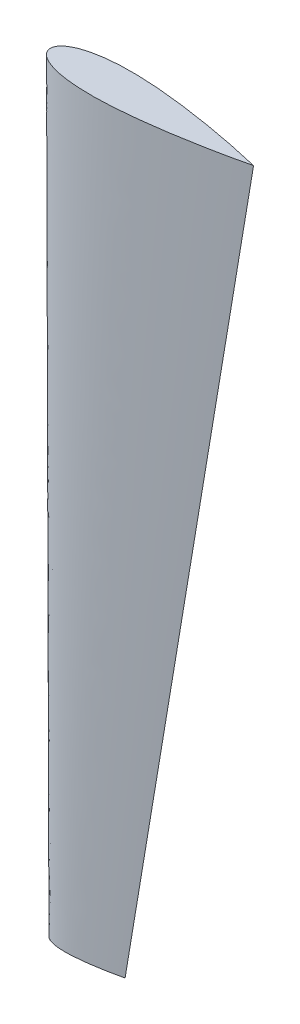
ISO-10303-21;
HEADER;
FILE_DESCRIPTION(('STEP AP214'),'2;1');
FILE_NAME('part.step','',(''),(''),'','','');
FILE_SCHEMA(('AUTOMOTIVE_DESIGN { 1 0 10303 214 1 1 1 1 }'));
ENDSEC;
DATA;
#1=APPLICATION_CONTEXT('core data for automotive mechanical design processes');
#2=APPLICATION_PROTOCOL_DEFINITION('international standard','automotive_design',2000,#1);
#3=PRODUCT_CONTEXT('',#1,'mechanical');
#4=PRODUCT('Part','Part','',(#3));
#5=PRODUCT_RELATED_PRODUCT_CATEGORY('part','',(#4));
#6=PRODUCT_DEFINITION_FORMATION('','',#4);
#7=PRODUCT_DEFINITION_CONTEXT('part definition',#1,'design');
#8=PRODUCT_DEFINITION('design','',#6,#7);
#9=PRODUCT_DEFINITION_SHAPE('','',#8);
#10=(LENGTH_UNIT() NAMED_UNIT(*) SI_UNIT(.MILLI.,.METRE.));
#11=(NAMED_UNIT(*) PLANE_ANGLE_UNIT() SI_UNIT($,.RADIAN.));
#12=(NAMED_UNIT(*) SI_UNIT($,.STERADIAN.) SOLID_ANGLE_UNIT());
#13=UNCERTAINTY_MEASURE_WITH_UNIT(LENGTH_MEASURE(1.E-05),#10,'distance_accuracy_value','');
#14=(GEOMETRIC_REPRESENTATION_CONTEXT(3) GLOBAL_UNCERTAINTY_ASSIGNED_CONTEXT((#13)) GLOBAL_UNIT_ASSIGNED_CONTEXT((#10,
#11,#12)) REPRESENTATION_CONTEXT('',''));
#15=CARTESIAN_POINT('',(0.,0.,0.));
#16=DIRECTION('',(0.,0.,1.));
#17=DIRECTION('',(1.,0.,0.));
#18=AXIS2_PLACEMENT_3D('',#15,#16,#17);
#19=CARTESIAN_POINT('',(66.0178620616339,514.,12.1870773540183));
#20=DIRECTION('',(0.,-1.,0.));
#21=DIRECTION('',(0.,0.,-1.));
#22=AXIS2_PLACEMENT_3D('',#19,#20,#21);
#23=PLANE('',#22);
#24=CARTESIAN_POINT('',(0.,514.,-3.58879872712089E-12));
#25=CARTESIAN_POINT('',(-9.62389065432209E-05,514.,0.229826737293405));
#26=CARTESIAN_POINT('',(0.0203386864435173,514.,0.626377200940641));
#27=CARTESIAN_POINT('',(0.10246108280261,514.,1.20171389372342));
#28=CARTESIAN_POINT('',(0.311904811280085,514.,1.94931182640597));
#29=CARTESIAN_POINT('',(0.605447679738566,514.,2.66244555417272));
#30=CARTESIAN_POINT('',(1.027685977397,514.,3.41930257540994));
#31=CARTESIAN_POINT('',(1.61928269539491,514.,4.23690298840914));
#32=CARTESIAN_POINT('',(2.44409296410368,514.,5.1338522154251));
#33=CARTESIAN_POINT('',(3.60602649969797,514.,6.13791511730763));
#34=CARTESIAN_POINT('',(5.25185526426223,514.,7.26308481056953));
#35=CARTESIAN_POINT('',(7.54715016389206,514.,8.48956799779035));
#36=CARTESIAN_POINT('',(10.7862450507375,514.,9.81456784612829));
#37=CARTESIAN_POINT('',(14.9988819464501,514.,11.0780777681388));
#38=CARTESIAN_POINT('',(21.1448502055022,514.,12.3689712831595));
#39=CARTESIAN_POINT('',(29.0419896559888,514.,13.3110862714259));
#40=CARTESIAN_POINT('',(38.2843743035246,514.,13.7180246588027));
#41=CARTESIAN_POINT('',(48.6947882758269,514.,13.5365121366165));
#42=CARTESIAN_POINT('',(59.084069854855,514.,12.8875223108892));
#43=CARTESIAN_POINT('',(69.4444186753305,514.,11.8840149961523));
#44=CARTESIAN_POINT('',(79.7733856541514,514.,10.6042324725989));
#45=CARTESIAN_POINT('',(88.7848000115046,514.,9.28769971435329));
#46=CARTESIAN_POINT('',(96.4895454807425,514.,8.03899914374762));
#47=CARTESIAN_POINT('',(102.898095596124,514.,6.92276219430765));
#48=CARTESIAN_POINT('',(108.015717075038,514.,5.98590645888455));
#49=CARTESIAN_POINT('',(112.48902046287,514.,5.12698484650111));
#50=CARTESIAN_POINT('',(116.313274011786,514.,4.36398312797738));
#51=CARTESIAN_POINT('',(119.503911266981,514.,3.70727426462731));
#52=CARTESIAN_POINT('',(121.721649175323,514.,3.2407052226471));
#53=CARTESIAN_POINT('',(123.647234718723,514.,2.82700244224191));
#54=CARTESIAN_POINT('',(125.521665439083,514.,2.41932597007425));
#55=CARTESIAN_POINT('',(127.174331301088,514.,2.05225729333034));
#56=CARTESIAN_POINT('',(128.65143701865,514.,1.72222406225193));
#57=CARTESIAN_POINT('',(130.720100002365,514.,1.2476966868119));
#58=CARTESIAN_POINT('',(132.31691175783,514.,0.880619787764973));
#59=CARTESIAN_POINT('',(134.292315332336,514.,0.411219700931635));
#60=CARTESIAN_POINT('',(135.424693489945,514.,0.139368002056263));
#61=CARTESIAN_POINT('',(135.999999999464,514.,1.26223972346886E-10));
#62=B_SPLINE_CURVE_WITH_KNOTS('',4,(#24,#25,#26,#27,#28,#29,#30,#31,#32,#33,#34,#35,#36,#37,#38,
#39,#40,#41,#42,#43,#44,#45,#46,#47,#48,#49,#50,#51,#52,#53,#54,#55,#56,#57,#58,#59,#60,#61),
.UNSPECIFIED.,.F.,.F.,(5,1,1,1,1,1,1,1,1,1,1,1,1,1,1,1,1,1,1,1,1,1,1,1,1,1,1,1,1,1,1,1,1,1,5),
(0.,0.00587453097731684,0.010168378239424,0.0148281459801956,0.0198354441070051,
0.0255747363868891,0.0323088782353767,0.0406095113955877,0.0509668935399592,0.0648121190604378,
0.0832532478295698,0.107120705349692,0.14042968191049,0.177263566086309,0.243881637309456,
0.310499708067123,0.377117784194045,0.443735860910882,0.510353937013769,0.576972013445223,
0.643590090639979,0.676899129664545,0.71020816868911,0.743517207401256,0.776826246113401,
0.793480765951165,0.810135285788928,0.826789805626691,0.835117065545573,0.843444325464454,
0.86009884511682,0.868426104943003,0.876753364769186,0.893407884421552,0.910062404073918),.UNSPECIFIED.);
#63=CARTESIAN_POINT('',(0.,514.,-3.58968690554059E-12));
#64=VERTEX_POINT('',#63);
#65=CARTESIAN_POINT('',(135.999999999508,514.,-1.22707127833556E-10));
#66=VERTEX_POINT('',#65);
#67=EDGE_CURVE('E71',#64,#66,#62,.T.);
#68=ORIENTED_EDGE('',*,*,#67,.T.);
#69=CARTESIAN_POINT('',(135.999999999508,514.,-1.22707127833556E-10));
#70=CARTESIAN_POINT('',(135.424693489978,514.,-0.139368002055618));
#71=CARTESIAN_POINT('',(134.292315332367,514.,-0.411219700931609));
#72=CARTESIAN_POINT('',(132.31691175784,514.,-0.880619787769804));
#73=CARTESIAN_POINT('',(130.720100002365,514.,-1.24769668681908));
#74=CARTESIAN_POINT('',(128.65143701865,514.,-1.7222240622591));
#75=CARTESIAN_POINT('',(127.174331301088,514.,-2.05225729333752));
#76=CARTESIAN_POINT('',(125.521665439083,514.,-2.41932597008143));
#77=CARTESIAN_POINT('',(123.647234718723,514.,-2.82700244224909));
#78=CARTESIAN_POINT('',(121.721649175323,514.,-3.24070522265428));
#79=CARTESIAN_POINT('',(119.503911266981,514.,-3.70727426463448));
#80=CARTESIAN_POINT('',(116.313274011786,514.,-4.36398312798456));
#81=CARTESIAN_POINT('',(112.48902046287,514.,-5.12698484650829));
#82=CARTESIAN_POINT('',(108.015717075038,514.,-5.98590645889172));
#83=CARTESIAN_POINT('',(102.898095596124,514.,-6.92276219431483));
#84=CARTESIAN_POINT('',(96.4895454807425,514.,-8.0389991437548));
#85=CARTESIAN_POINT('',(88.7848000115046,514.,-9.28769971436047));
#86=CARTESIAN_POINT('',(79.7733856541514,514.,-10.604232472606));
#87=CARTESIAN_POINT('',(69.4444186753305,514.,-11.8840149961595));
#88=CARTESIAN_POINT('',(59.084069854855,514.,-12.8875223108964));
#89=CARTESIAN_POINT('',(48.6947882758269,514.,-13.5365121366237));
#90=CARTESIAN_POINT('',(38.2843743035246,514.,-13.7180246588099));
#91=CARTESIAN_POINT('',(29.0419896559888,514.,-13.3110862714331));
#92=CARTESIAN_POINT('',(21.1448502055022,514.,-12.3689712831667));
#93=CARTESIAN_POINT('',(14.9988819464501,514.,-11.078077768146));
#94=CARTESIAN_POINT('',(10.7862450507375,514.,-9.81456784613547));
#95=CARTESIAN_POINT('',(7.54715016389206,514.,-8.48956799779753));
#96=CARTESIAN_POINT('',(5.25185526426223,514.,-7.26308481057671));
#97=CARTESIAN_POINT('',(3.60602649969797,514.,-6.13791511731481));
#98=CARTESIAN_POINT('',(2.44409296410368,514.,-5.13385221543228));
#99=CARTESIAN_POINT('',(1.61928269539491,514.,-4.23690298841632));
#100=CARTESIAN_POINT('',(1.027685977397,514.,-3.41930257541712));
#101=CARTESIAN_POINT('',(0.605447679738566,514.,-2.6624455541799));
#102=CARTESIAN_POINT('',(0.311904811280085,514.,-1.94931182641315));
#103=CARTESIAN_POINT('',(0.10246108280261,514.,-1.2017138937306));
#104=CARTESIAN_POINT('',(0.0203386864435173,514.,-0.62637720094782));
#105=CARTESIAN_POINT('',(-9.62389065432209E-05,514.,-0.229826737300583));
#106=CARTESIAN_POINT('',(0.,514.,-3.58968690554059E-12));
#107=B_SPLINE_CURVE_WITH_KNOTS('',4,(#69,#70,#71,#72,#73,#74,#75,#76,#77,#78,#79,#80,#81,#82,
#83,#84,#85,#86,#87,#88,#89,#90,#91,#92,#93,#94,#95,#96,#97,#98,#99,#100,#101,#102,#103,#104,
#105,#106),.UNSPECIFIED.,.F.,.F.,(5,1,1,1,1,1,1,1,1,1,1,1,1,1,1,1,1,1,1,1,1,1,1,1,1,1,1,1,1,1,1,
1,1,1,5),(0.,0.0166545196523659,0.0333090393047316,0.0416362991309146,0.0499635589570975,
0.0666180786094633,0.074945338528345,0.0832725984472266,0.0999271182849898,0.116581638122753,
0.133236157960516,0.166545196672662,0.199854235384807,0.233163274409373,0.266472313433939,
0.333090390628695,0.399708467060149,0.466326543163036,0.532944619879873,0.599562696006795,
0.666180766764462,0.732798837987609,0.769632722163427,0.802941698724226,0.826809156244348,
0.84525028501348,0.859095510533958,0.86945289267833,0.877753525838541,0.884487667687029,
0.890226959966913,0.895234258093722,0.899894025834494,0.904187873096601,0.910062404073918),.UNSPECIFIED.);
#108=EDGE_CURVE('E12',#66,#64,#107,.T.);
#109=ORIENTED_EDGE('',*,*,#108,.T.);
#110=EDGE_LOOP('',(#68,#109));
#111=FACE_BOUND('',#110,.T.);
#112=ADVANCED_FACE('F61',(#111),#23,.F.);
#113=CARTESIAN_POINT('',(24.2712617534065,0.,4.48054582805587));
#114=DIRECTION('',(0.,-1.,0.));
#115=DIRECTION('',(0.,0.,-1.));
#116=AXIS2_PLACEMENT_3D('',#113,#114,#115);
#117=PLANE('',#116);
#118=CARTESIAN_POINT('',(0.,0.,0.));
#119=CARTESIAN_POINT('',(-3.57597322857492E-05,0.,0.084497568888036));
#120=CARTESIAN_POINT('',(0.00747749906732974,0.,0.230287239826051));
#121=CARTESIAN_POINT('',(0.0376698863574468,0.,0.441804118405084));
#122=CARTESIAN_POINT('',(0.114670660824089,0.,0.716660066376853));
#123=CARTESIAN_POINT('',(0.222591161663102,0.,0.978839520024002));
#124=CARTESIAN_POINT('',(0.377825674088309,0.,1.25709694766434));
#125=CARTESIAN_POINT('',(0.595324455384656,0.,1.55768470827881));
#126=CARTESIAN_POINT('',(0.898563756079407,0.,1.8874457732575));
#127=CARTESIAN_POINT('',(1.32574470774678,0.,2.25658643812188));
#128=CARTESIAN_POINT('',(1.93082974290689,0.,2.67025167576308));
#129=CARTESIAN_POINT('',(2.77468652819462,0.,3.1211649230953));
#130=CARTESIAN_POINT('',(3.96553304621347,0.,3.60829659124632));
#131=CARTESIAN_POINT('',(5.514291907565,0.,4.07282340728828));
#132=CARTESIAN_POINT('',(7.77384720306645,0.,4.54741465579239));
#133=CARTESIAN_POINT('',(10.6771922410552,0.,4.89378409830209));
#134=CARTESIAN_POINT('',(14.0751535762197,0.,5.04338755005186));
#135=CARTESIAN_POINT('',(17.9024724549107,0.,4.97666450694003));
#136=CARTESIAN_POINT('',(21.7221212013291,0.,4.73805077452825));
#137=CARTESIAN_POINT('',(25.5309755502663,0.,4.3691378876451));
#138=CARTESIAN_POINT('',(29.3285571230623,0.,3.89858904743883));
#139=CARTESIAN_POINT('',(32.6412984597572,0.,3.41463722967284));
#140=CARTESIAN_POINT('',(35.4743653385762,0.,2.95544945825426));
#141=CARTESIAN_POINT('',(37.8297349497232,0.,2.54524163111396));
#142=CARTESIAN_POINT('',(39.7126170500219,0.,2.20046895817504));
#143=CARTESIAN_POINT('',(41.589312775238,0.,1.84026717255085));
#144=CARTESIAN_POINT('',(43.2341035438203,0.,1.50940545406725));
#145=CARTESIAN_POINT('',(44.6326942516853,0.,1.21743530792212));
#146=CARTESIAN_POINT('',(45.8112139261382,0.,0.963318516211182));
#147=CARTESIAN_POINT('',(46.7266390701642,0.,0.761946879555926));
#148=CARTESIAN_POINT('',(47.6959028902503,0.,0.542685100454476));
#149=CARTESIAN_POINT('',(48.559880658311,0.,0.343928912386446));
#150=CARTESIAN_POINT('',(49.3595466036412,0.,0.154242875548077));
#151=CARTESIAN_POINT('',(49.7884902537762,0.,0.0512382360226681));
#152=CARTESIAN_POINT('',(49.9999999999664,0.,8.15106896752495E-12));
#153=B_SPLINE_CURVE_WITH_KNOTS('',4,(#118,#119,#120,#121,#122,#123,#124,#125,#126,#127,#128,
#129,#130,#131,#132,#133,#134,#135,#136,#137,#138,#139,#140,#141,#142,#143,#144,#145,#146,#147,
#148,#149,#150,#151,#152),.UNSPECIFIED.,.F.,.F.,(5,1,1,1,1,1,1,1,1,1,1,1,1,1,1,1,1,1,1,1,1,1,1,
1,1,1,1,1,1,1,1,5),(0.,0.00587453097731684,0.010168378239424,0.0148281459801956,
0.019835444107005,0.0255747363868891,0.0323088782353766,0.0406095113955876,0.050966893539959,
0.0648121190604376,0.0832532478295695,0.107120705349691,0.14042968191049,0.177263566086309,
0.243881637309455,0.310499708067123,0.377117784194047,0.443735860910885,0.51035393701377,
0.576972013445224,0.643590090639975,0.676899129664538,0.710208168689101,0.743517207401244,
0.776826246113387,0.810135285788911,0.826789805626673,0.843444325464435,0.860098845116806,
0.876753364769177,0.893407884421549,0.91006240407392),.UNSPECIFIED.);
#154=CARTESIAN_POINT('',(0.,0.,0.));
#155=VERTEX_POINT('',#154);
#156=CARTESIAN_POINT('',(49.9999999999691,0.,-7.47887518688634E-12));
#157=VERTEX_POINT('',#156);
#158=EDGE_CURVE('E95',#155,#157,#153,.T.);
#159=ORIENTED_EDGE('',*,*,#158,.F.);
#160=CARTESIAN_POINT('',(49.9999999999691,0.,-7.47887518688634E-12));
#161=CARTESIAN_POINT('',(49.7884902537783,0.,-0.0512382360221614));
#162=CARTESIAN_POINT('',(49.3595466036429,0.,-0.154242875547662));
#163=CARTESIAN_POINT('',(48.5598806583117,0.,-0.343928912386284));
#164=CARTESIAN_POINT('',(47.6959028902503,0.,-0.542685100454476));
#165=CARTESIAN_POINT('',(46.7266390701642,0.,-0.761946879555926));
#166=CARTESIAN_POINT('',(45.8112139261382,0.,-0.963318516211182));
#167=CARTESIAN_POINT('',(44.6326942516853,0.,-1.21743530792212));
#168=CARTESIAN_POINT('',(43.2341035438203,0.,-1.50940545406725));
#169=CARTESIAN_POINT('',(41.589312775238,0.,-1.84026717255085));
#170=CARTESIAN_POINT('',(39.7126170500219,0.,-2.20046895817504));
#171=CARTESIAN_POINT('',(37.8297349497232,0.,-2.54524163111396));
#172=CARTESIAN_POINT('',(35.4743653385762,0.,-2.95544945825426));
#173=CARTESIAN_POINT('',(32.6412984597572,0.,-3.41463722967284));
#174=CARTESIAN_POINT('',(29.3285571230623,0.,-3.89858904743883));
#175=CARTESIAN_POINT('',(25.5309755502663,0.,-4.3691378876451));
#176=CARTESIAN_POINT('',(21.7221212013291,0.,-4.73805077452825));
#177=CARTESIAN_POINT('',(17.9024724549107,0.,-4.97666450694003));
#178=CARTESIAN_POINT('',(14.0751535762197,0.,-5.04338755005186));
#179=CARTESIAN_POINT('',(10.6771922410552,0.,-4.89378409830209));
#180=CARTESIAN_POINT('',(7.77384720306645,0.,-4.54741465579239));
#181=CARTESIAN_POINT('',(5.514291907565,0.,-4.07282340728828));
#182=CARTESIAN_POINT('',(3.96553304621347,0.,-3.60829659124632));
#183=CARTESIAN_POINT('',(2.77468652819462,0.,-3.1211649230953));
#184=CARTESIAN_POINT('',(1.93082974290689,0.,-2.67025167576308));
#185=CARTESIAN_POINT('',(1.32574470774678,0.,-2.25658643812188));
#186=CARTESIAN_POINT('',(0.898563756079407,0.,-1.8874457732575));
#187=CARTESIAN_POINT('',(0.595324455384656,0.,-1.55768470827881));
#188=CARTESIAN_POINT('',(0.377825674088309,0.,-1.25709694766434));
#189=CARTESIAN_POINT('',(0.222591161663102,0.,-0.978839520024002));
#190=CARTESIAN_POINT('',(0.114670660824089,0.,-0.716660066376853));
#191=CARTESIAN_POINT('',(0.0376698863574468,0.,-0.441804118405084));
#192=CARTESIAN_POINT('',(0.00747749906732974,0.,-0.230287239826051));
#193=CARTESIAN_POINT('',(-3.57597322857492E-05,0.,-0.084497568888036));
#194=CARTESIAN_POINT('',(0.,0.,0.));
#195=B_SPLINE_CURVE_WITH_KNOTS('',4,(#160,#161,#162,#163,#164,#165,#166,#167,#168,#169,#170,
#171,#172,#173,#174,#175,#176,#177,#178,#179,#180,#181,#182,#183,#184,#185,#186,#187,#188,#189,
#190,#191,#192,#193,#194),.UNSPECIFIED.,.F.,.F.,(5,1,1,1,1,1,1,1,1,1,1,1,1,1,1,1,1,1,1,1,1,1,1,
1,1,1,1,1,1,1,1,5),(0.,0.0166545196523712,0.0333090393047425,0.0499635589571138,
0.066618078609485,0.0832725984472469,0.0999271182850088,0.133236157960533,0.166545196672676,
0.199854235384819,0.233163274409382,0.266472313433945,0.333090390628696,0.399708467060149,
0.466326543163034,0.532944619879873,0.599562696006797,0.666180766764464,0.73279883798761,
0.769632722163429,0.802941698724228,0.82680915624435,0.845250285013482,0.859095510533961,
0.869452892678332,0.877753525838543,0.884487667687031,0.890226959966915,0.895234258093724,
0.899894025834496,0.904187873096603,0.91006240407392),.UNSPECIFIED.);
#196=EDGE_CURVE('E99',#157,#155,#195,.T.);
#197=ORIENTED_EDGE('',*,*,#196,.F.);
#198=EDGE_LOOP('',(#159,#197));
#199=FACE_BOUND('',#198,.T.);
#200=ADVANCED_FACE('F108',(#199),#117,.T.);
#201=CARTESIAN_POINT('',(0.,0.,0.));
#202=CARTESIAN_POINT('',(0.,514.,-3.58879872712089E-12));
#203=CARTESIAN_POINT('',(-5.77060039251501E-05,0.,0.136354964935307));
#204=CARTESIAN_POINT('',(-0.000155302133538279,514.,0.370874773291393));
#205=CARTESIAN_POINT('',(0.026427885356802,0.,0.408506654633258));
#206=CARTESIAN_POINT('',(0.0698550739459451,514.,1.11026191120697));
#207=CARTESIAN_POINT('',(0.177830273893335,0.,0.93359240455535));
#208=CARTESIAN_POINT('',(0.484979401682503,514.,2.53958536788174));
#209=CARTESIAN_POINT('',(0.536692756106214,0.,1.52207028272615));
#210=CARTESIAN_POINT('',(1.45900496820679,514.,4.13985126659066));
#211=CARTESIAN_POINT('',(1.11841355600915,0.,2.09925407360706));
#212=CARTESIAN_POINT('',(3.04255585392648,513.999999999999,5.7101063263419));
#213=CARTESIAN_POINT('',(1.78440897923451,0.,2.57597667365814));
#214=CARTESIAN_POINT('',(4.85322553628139,514.000000000001,7.00658612417236));
#215=CARTESIAN_POINT('',(2.49808377670932,0.,2.97398195093026));
#216=CARTESIAN_POINT('',(6.79525408195852,513.999999999999,8.08934554638942));
#217=CARTESIAN_POINT('',(3.24297118734081,0.,3.31140694383471));
#218=CARTESIAN_POINT('',(8.82016608373245,514.,9.00691547166225));
#219=CARTESIAN_POINT('',(4.00675579019653,0.,3.59934496434176));
#220=CARTESIAN_POINT('',(10.8997090454673,514.,9.79037584401568));
#221=CARTESIAN_POINT('',(4.78659419400027,0.,3.84708140924929));
#222=CARTESIAN_POINT('',(13.0173414337009,514.000000000001,10.4637710264153));
#223=CARTESIAN_POINT('',(5.5746210407108,0.,4.06017116674337));
#224=CARTESIAN_POINT('',(15.1621440721244,514.,11.0431539797648));
#225=CARTESIAN_POINT('',(6.36995259828995,0.,4.24316199186172));
#226=CARTESIAN_POINT('',(17.3276443599233,514.,11.5418428763728));
#227=CARTESIAN_POINT('',(7.17170513469953,0.,4.40060163964204));
#228=CARTESIAN_POINT('',(19.5070018099208,514.,11.9696485004776));
#229=CARTESIAN_POINT('',(8.24659657288618,0.,4.57967472467971));
#230=CARTESIAN_POINT('',(22.4305961433654,514.000000000001,12.4566203704796));
#231=CARTESIAN_POINT('',(9.59623863469544,0.,4.75171985431146));
#232=CARTESIAN_POINT('',(26.1019024554668,513.999999999999,12.9247476382807));
#233=CARTESIAN_POINT('',(11.2247461474749,0.,4.8905347466885));
#234=CARTESIAN_POINT('',(30.531246241591,514.000000000001,13.3022186448045));
#235=CARTESIAN_POINT('',(12.8559119540668,0.,4.97245962472459));
#236=CARTESIAN_POINT('',(34.9680929255466,513.999999999999,13.5251049541223));
#237=CARTESIAN_POINT('',(14.4892911122536,0.,5.00579240085891));
#238=CARTESIAN_POINT('',(39.4108815386297,514.000000000001,13.6157576206361));
#239=CARTESIAN_POINT('',(16.1226907299499,0.,4.99707110196688));
#240=CARTESIAN_POINT('',(43.8537172065679,514.,13.5920282060974));
#241=CARTESIAN_POINT('',(17.7555992584481,0.,4.95175064375915));
#242=CARTESIAN_POINT('',(48.2952646461151,513.999999999999,13.4687689643388));
#243=CARTESIAN_POINT('',(19.3872272815121,0.,4.87430539747984));
#244=CARTESIAN_POINT('',(52.7332234053464,514.000000000001,13.2580896741142));
#245=CARTESIAN_POINT('',(21.0172254161805,0.,4.76848444176642));
#246=CARTESIAN_POINT('',(57.1668842726475,513.999999999999,12.9703321988775));
#247=CARTESIAN_POINT('',(22.6454466532525,0.,4.63749779150105));
#248=CARTESIAN_POINT('',(61.5955046711648,514.,12.613901608913));
#249=CARTESIAN_POINT('',(24.2715577397416,0.,4.48387823116173));
#250=CARTESIAN_POINT('',(66.0187875872362,514.,12.1962779167295));
#251=CARTESIAN_POINT('',(25.8954725294838,0.,4.31018682072122));
#252=CARTESIAN_POINT('',(70.4365528419378,514.,11.7234821278594));
#253=CARTESIAN_POINT('',(28.0583152093226,0.,4.05403077367717));
#254=CARTESIAN_POINT('',(76.3186330345252,513.999999999999,11.0270267484568));
#255=CARTESIAN_POINT('',(30.758445401673,0.,3.69188721591247));
#256=CARTESIAN_POINT('',(83.6630659656256,514.000000000001,10.0419708260178));
#257=CARTESIAN_POINT('',(33.9834477941743,0.,3.20204763235566));
#258=CARTESIAN_POINT('',(92.4350653089491,514.,8.7093585644395));
#259=CARTESIAN_POINT('',(37.21484063885,0.,2.65857172330101));
#260=CARTESIAN_POINT('',(101.224411126754,514.000000000001,7.23175411785769));
#261=CARTESIAN_POINT('',(40.4085593368478,0.,2.07392958336722));
#262=CARTESIAN_POINT('',(109.914028590157,513.999999999998,5.63959814489896));
#263=CARTESIAN_POINT('',(43.114002003016,0.,1.53574061064637));
#264=CARTESIAN_POINT('',(117.25766460203,514.000000000001,4.18129207873118));
#265=CARTESIAN_POINT('',(45.2072081815133,0.,1.0958590426547));
#266=CARTESIAN_POINT('',(122.97619441282,514.,2.9768203100236));
#267=CARTESIAN_POINT('',(46.7983345801096,0.,0.747245851418447));
#268=CARTESIAN_POINT('',(127.39668976694,514.000000000001,2.00812672384285));
#269=CARTESIAN_POINT('',(48.467478485371,0.,0.365893824604671));
#270=CARTESIAN_POINT('',(131.581087338885,514.,1.05571604804933));
#271=CARTESIAN_POINT('',(49.5184313524344,0.,0.116660004872655));
#272=CARTESIAN_POINT('',(134.690133278447,514.,0.317315213290729));
#273=CARTESIAN_POINT('',(49.9999999999664,0.,8.15106896752495E-12));
#274=CARTESIAN_POINT('',(135.999999999464,514.,1.26223972346886E-10));
#275=B_SPLINE_SURFACE_WITH_KNOTS('',3,1,((#201,#202),(#203,#204),(#205,#206),(#207,#208),(#209,
#210),(#211,#212),(#213,#214),(#215,#216),(#217,#218),(#219,#220),(#221,#222),(#223,#224),(#225,
#226),(#227,#228),(#229,#230),(#231,#232),(#233,#234),(#235,#236),(#237,#238),(#239,#240),(#241,
#242),(#243,#244),(#245,#246),(#247,#248),(#249,#250),(#251,#252),(#253,#254),(#255,#256),(#257,
#258),(#259,#260),(#261,#262),(#263,#264),(#265,#266),(#267,#268),(#269,#270),(#271,#272),(#273,
#274)),.UNSPECIFIED.,.F.,.F.,.F.,(4,1,1,1,1,1,1,1,1,1,1,1,1,1,1,1,1,1,1,1,1,1,1,1,1,1,1,1,1,1,1,
1,1,1,4),(2,2),(0.,0.0078125,0.015625,0.03125,0.046875,0.0625,0.078125,0.09375,0.109375,0.125,
0.140625,0.15625,0.171875,0.1875,0.21875,0.25,0.28125,0.3125,0.34375,0.375,0.40625,0.4375,
0.46875,0.5,0.53125,0.5625,0.625,0.6875,0.75,0.8125,0.875,0.90625,0.9375,0.96875,1.),(0.,1.),.UNSPECIFIED.);
#276=DIRECTION('',(0.165021285012085,0.986290005775665,2.26564444661439E-13));
#277=VECTOR('',#276,1.);
#278=CARTESIAN_POINT('',(92.9999999997152,257.,6.71875206572056E-11));
#279=LINE('',#278,#277);
#280=EDGE_CURVE('E79',#157,#66,#279,.T.);
#281=DIRECTION('',(0.,-1.,0.));
#282=VECTOR('',#281,1.);
#283=CARTESIAN_POINT('',(0.,257.,-1.7943091579397E-12));
#284=LINE('',#283,#282);
#285=EDGE_CURVE('E91',#64,#155,#284,.T.);
#286=ORIENTED_EDGE('',*,*,#158,.T.);
#287=ORIENTED_EDGE('',*,*,#280,.T.);
#288=ORIENTED_EDGE('',*,*,#67,.F.);
#289=ORIENTED_EDGE('',*,*,#285,.T.);
#290=EDGE_LOOP('',(#286,#287,#288,#289));
#291=FACE_BOUND('',#290,.T.);
#292=ADVANCED_FACE('F93',(#291),#275,.T.);
#293=CARTESIAN_POINT('',(49.9999999999691,0.,-7.47887518688634E-12));
#294=CARTESIAN_POINT('',(135.999999999508,514.,-1.22707127833556E-10));
#295=CARTESIAN_POINT('',(49.5184313524356,0.,-0.116660004872359));
#296=CARTESIAN_POINT('',(134.690133278465,514.,-0.317315213293751));
#297=CARTESIAN_POINT('',(48.4674784323656,0.,-0.365893833230846));
#298=CARTESIAN_POINT('',(131.581168896841,514.,-1.05569052750906));
#299=CARTESIAN_POINT('',(46.7983344877147,0.,-0.747245866768587));
#300=CARTESIAN_POINT('',(127.396583695114,514.,-2.00816441331214));
#301=CARTESIAN_POINT('',(45.2072082889809,0.,-1.09585902642017));
#302=CARTESIAN_POINT('',(122.975867939862,514.,-2.97686627456848));
#303=CARTESIAN_POINT('',(43.1140022285211,0.,-1.53574057421096));
#304=CARTESIAN_POINT('',(117.262694375496,514.000000000001,-4.18028337962444));
#305=CARTESIAN_POINT('',(40.4085585550983,0.,-2.07392969962237));
#306=CARTESIAN_POINT('',(109.911317755402,513.999999999999,-5.64012680483378));
#307=CARTESIAN_POINT('',(37.2148421822908,0.,-2.65857150537826));
#308=CARTESIAN_POINT('',(101.225764698166,514.000000000001,-7.23149873955673));
#309=CARTESIAN_POINT('',(33.9834445630783,0.,-3.2020480653727));
#310=CARTESIAN_POINT('',(92.4343886229903,513.999999999999,-8.70948171383471));
#311=CARTESIAN_POINT('',(30.7584510985759,0.,-3.69188649603577));
#312=CARTESIAN_POINT('',(83.6634419489778,514.000000000001,-10.0419030719406));
#313=CARTESIAN_POINT('',(28.0583062455448,0.,-4.05403182061778));
#314=CARTESIAN_POINT('',(76.3185421910144,513.999999999999,-11.0270466217047));
#315=CARTESIAN_POINT('',(25.8954813740865,0.,-4.31018586949419));
#316=CARTESIAN_POINT('',(70.4366771804512,514.,-11.723463320741));
#317=CARTESIAN_POINT('',(24.2715740483703,0.,-4.48387646050784));
#318=CARTESIAN_POINT('',(66.0187102433689,514.,-12.1962887597295));
#319=CARTESIAN_POINT('',(22.6454438729259,0.,-4.6374982656288));
#320=CARTESIAN_POINT('',(61.5955490160358,514.,-12.613895858809));
#321=CARTESIAN_POINT('',(21.0172258497544,0.,-4.7684841821835));
#322=CARTESIAN_POINT('',(57.1668608019519,514.,-12.9703349040819));
#323=CARTESIAN_POINT('',(19.3872277472412,0.,-4.87430567881353));
#324=CARTESIAN_POINT('',(52.7332385043475,514.,-13.2580882836551));
#325=CARTESIAN_POINT('',(17.7555980270031,0.,-4.95175021369728));
#326=CARTESIAN_POINT('',(48.2952537847833,514.,-13.4687694617708));
#327=CARTESIAN_POINT('',(16.122693153177,0.,-4.99707184608757));
#328=CARTESIAN_POINT('',(43.8537273007881,513.999999999999,-13.5920283668038));
#329=CARTESIAN_POINT('',(14.4892863041831,0.,-5.00579097071379));
#330=CARTESIAN_POINT('',(39.4108658855951,514.000000000001,-13.6157566487793));
#331=CARTESIAN_POINT('',(12.8559213039552,0.,-4.97246238122191));
#332=CARTESIAN_POINT('',(34.9681173647088,513.999999999999,-13.5251069740233));
#333=CARTESIAN_POINT('',(11.2247279145255,0.,-4.89052938369063));
#334=CARTESIAN_POINT('',(30.5312011494424,514.,-13.3022141770338));
#335=CARTESIAN_POINT('',(9.59627125131965,0.,-4.7517294422274));
#336=CARTESIAN_POINT('',(26.1019865858896,514.,-12.9247573594581));
#337=CARTESIAN_POINT('',(8.24655493919965,0.,-4.57966248839232));
#338=CARTESIAN_POINT('',(22.4304626960043,513.999999999999,-12.4566030636268));
#339=CARTESIAN_POINT('',(7.17172321932167,0.,-4.40060695358437));
#340=CARTESIAN_POINT('',(19.5069970813492,514.,-11.9696452379312));
#341=CARTESIAN_POINT('',(6.36998999121728,0.,-4.24317298169537));
#342=CARTESIAN_POINT('',(17.3276536008294,514.,-11.5418461183256));
#343=CARTESIAN_POINT('',(5.5745672218121,0.,-4.06015535411026));
#344=CARTESIAN_POINT('',(15.1621380195222,513.999999999999,-11.043151659454));
#345=CARTESIAN_POINT('',(4.7864809484389,0.,-3.84704812839982));
#346=CARTESIAN_POINT('',(13.0173445349924,514.,-10.4637726347484));
#347=CARTESIAN_POINT('',(4.00675720843045,0.,-3.59934536213481));
#348=CARTESIAN_POINT('',(10.8997073465869,514.,-9.79037433764377));
#349=CARTESIAN_POINT('',(3.24297728518875,0.,-3.31140874734389));
#350=CARTESIAN_POINT('',(8.82016742283028,513.999999999999,-9.00691752795442));
#351=CARTESIAN_POINT('',(2.49807967842412,0.,-2.97398074022172));
#352=CARTESIAN_POINT('',(6.79525254203593,514.000000000001,-8.08934226757223));
#353=CARTESIAN_POINT('',(1.78441117527453,0.,-2.57597732230298));
#354=CARTESIAN_POINT('',(4.85322799857245,513.999999999999,-7.00659215050782));
#355=CARTESIAN_POINT('',(1.11841248549667,0.,-2.09925375742072));
#356=CARTESIAN_POINT('',(3.0425521158817,514.000000000001,-5.71009684704183));
#357=CARTESIAN_POINT('',(0.536693258009084,0.,-1.52207043096682));
#358=CARTESIAN_POINT('',(1.45901182607094,513.999999999999,-4.13986884400506));
#359=CARTESIAN_POINT('',(0.177830145236345,0.,-0.93359236655569));
#360=CARTESIAN_POINT('',(0.484968464360349,514.,-2.53955724436472));
#361=CARTESIAN_POINT('',(0.0264278216645616,0.,-0.408506635821329));
#362=CARTESIAN_POINT('',(0.0698559390283635,514.,-1.11026415467868));
#363=CARTESIAN_POINT('',(-5.77060039251509E-05,0.,-0.136354964935309));
#364=CARTESIAN_POINT('',(-0.000155302133538282,514.,-0.370874773298577));
#365=CARTESIAN_POINT('',(0.,0.,0.));
#366=CARTESIAN_POINT('',(0.,514.,-3.58968690554059E-12));
#367=B_SPLINE_SURFACE_WITH_KNOTS('',3,1,((#293,#294),(#295,#296),(#297,#298),(#299,#300),(#301,
#302),(#303,#304),(#305,#306),(#307,#308),(#309,#310),(#311,#312),(#313,#314),(#315,#316),(#317,
#318),(#319,#320),(#321,#322),(#323,#324),(#325,#326),(#327,#328),(#329,#330),(#331,#332),(#333,
#334),(#335,#336),(#337,#338),(#339,#340),(#341,#342),(#343,#344),(#345,#346),(#347,#348),(#349,
#350),(#351,#352),(#353,#354),(#355,#356),(#357,#358),(#359,#360),(#361,#362),(#363,#364),(#365,
#366)),.UNSPECIFIED.,.F.,.F.,.F.,(4,1,1,1,1,1,1,1,1,1,1,1,1,1,1,1,1,1,1,1,1,1,1,1,1,1,1,1,1,1,1,
1,1,1,4),(2,2),(0.,0.03125,0.0625,0.09375,0.125,0.1875,0.25,0.3125,0.375,0.4375,0.46875,0.5,
0.53125,0.5625,0.59375,0.625,0.65625,0.6875,0.71875,0.75,0.78125,0.8125,0.828125,0.84375,
0.859375,0.875,0.890625,0.90625,0.921875,0.9375,0.953125,0.96875,0.984375,0.9921875,1.),(0.,1.),.UNSPECIFIED.);
#368=ORIENTED_EDGE('',*,*,#196,.T.);
#369=ORIENTED_EDGE('',*,*,#285,.F.);
#370=ORIENTED_EDGE('',*,*,#108,.F.);
#371=ORIENTED_EDGE('',*,*,#280,.F.);
#372=EDGE_LOOP('',(#368,#369,#370,#371));
#373=FACE_BOUND('',#372,.T.);
#374=ADVANCED_FACE('F102',(#373),#367,.T.);
#375=CLOSED_SHELL('',(#112,#200,#292,#374));
#376=MANIFOLD_SOLID_BREP('B2',#375);
#377=ADVANCED_BREP_SHAPE_REPRESENTATION('',(#18,#376),#14);
#378=SHAPE_DEFINITION_REPRESENTATION(#9,#377);
ENDSEC;
END-ISO-10303-21;
